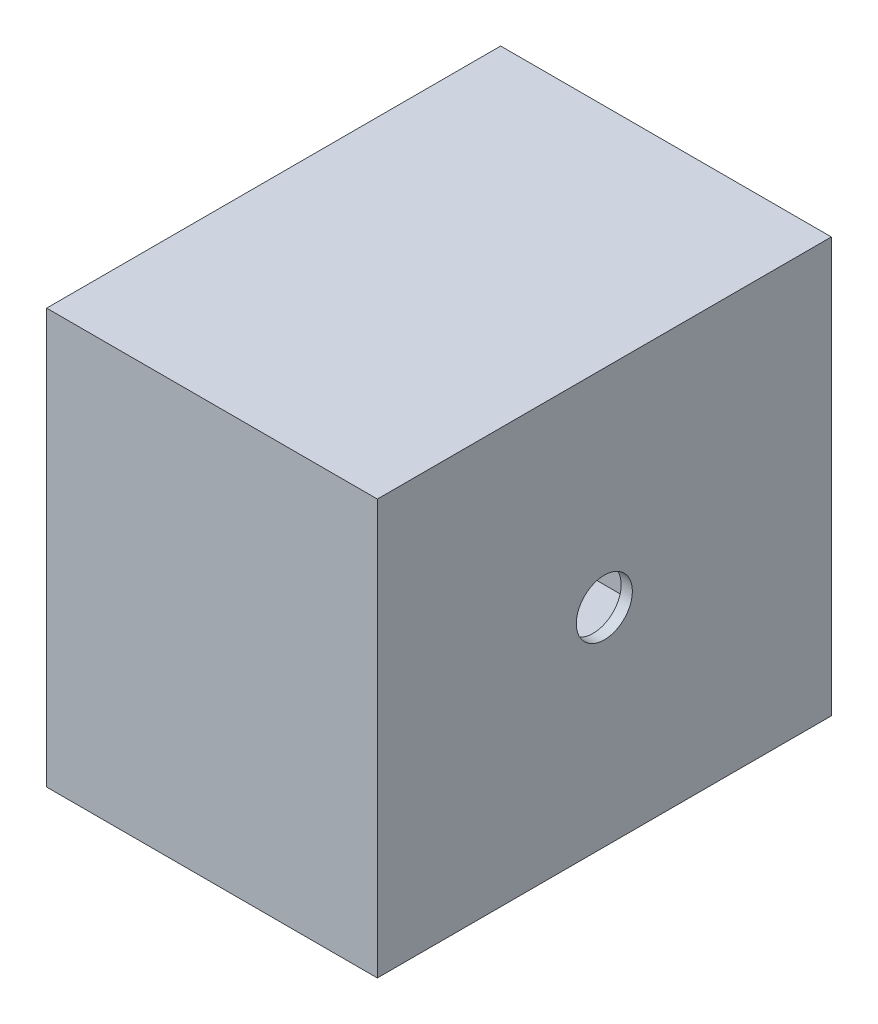
ISO-10303-21;
HEADER;
FILE_DESCRIPTION(('STEP AP214'),'2;1');
FILE_NAME('part.step','',(''),(''),'','','');
FILE_SCHEMA(('AUTOMOTIVE_DESIGN { 1 0 10303 214 1 1 1 1 }'));
ENDSEC;
DATA;
#1=APPLICATION_CONTEXT('core data for automotive mechanical design processes');
#2=APPLICATION_PROTOCOL_DEFINITION('international standard','automotive_design',2000,#1);
#3=PRODUCT_CONTEXT('',#1,'mechanical');
#4=PRODUCT('Part','Part','',(#3));
#5=PRODUCT_RELATED_PRODUCT_CATEGORY('part','',(#4));
#6=PRODUCT_DEFINITION_FORMATION('','',#4);
#7=PRODUCT_DEFINITION_CONTEXT('part definition',#1,'design');
#8=PRODUCT_DEFINITION('design','',#6,#7);
#9=PRODUCT_DEFINITION_SHAPE('','',#8);
#10=(LENGTH_UNIT() NAMED_UNIT(*) SI_UNIT(.MILLI.,.METRE.));
#11=(NAMED_UNIT(*) PLANE_ANGLE_UNIT() SI_UNIT($,.RADIAN.));
#12=(NAMED_UNIT(*) SI_UNIT($,.STERADIAN.) SOLID_ANGLE_UNIT());
#13=UNCERTAINTY_MEASURE_WITH_UNIT(LENGTH_MEASURE(1.E-05),#10,'distance_accuracy_value','');
#14=(GEOMETRIC_REPRESENTATION_CONTEXT(3) GLOBAL_UNCERTAINTY_ASSIGNED_CONTEXT((#13)) GLOBAL_UNIT_ASSIGNED_CONTEXT((#10,
#11,#12)) REPRESENTATION_CONTEXT('',''));
#15=CARTESIAN_POINT('',(0.,0.,0.));
#16=DIRECTION('',(0.,0.,1.));
#17=DIRECTION('',(1.,0.,0.));
#18=AXIS2_PLACEMENT_3D('',#15,#16,#17);
#19=CARTESIAN_POINT('',(160.,0.,0.));
#20=DIRECTION('',(-1.,0.,0.));
#21=DIRECTION('',(0.,0.,1.));
#22=AXIS2_PLACEMENT_3D('',#19,#20,#21);
#23=CYLINDRICAL_SURFACE('',#22,5.);
#24=CARTESIAN_POINT('',(2.,0.,0.));
#25=DIRECTION('',(-1.,0.,0.));
#26=DIRECTION('',(0.,0.,1.));
#27=AXIS2_PLACEMENT_3D('',#24,#25,#26);
#28=CIRCLE('',#27,5.);
#29=CARTESIAN_POINT('',(2.,0.,5.));
#30=VERTEX_POINT('',#29);
#31=EDGE_CURVE('E52',#30,#30,#28,.T.);
#32=ORIENTED_EDGE('',*,*,#31,.F.);
#33=EDGE_LOOP('',(#32));
#34=FACE_BOUND('',#33,.T.);
#35=CARTESIAN_POINT('',(0.,0.,0.));
#36=DIRECTION('',(1.,0.,0.));
#37=DIRECTION('',(0.,0.,-1.));
#38=AXIS2_PLACEMENT_3D('',#35,#36,#37);
#39=CIRCLE('',#38,5.);
#40=CARTESIAN_POINT('',(0.,0.,-5.));
#41=VERTEX_POINT('',#40);
#42=EDGE_CURVE('E182',#41,#41,#39,.T.);
#43=ORIENTED_EDGE('',*,*,#42,.F.);
#44=EDGE_LOOP('',(#43));
#45=FACE_BOUND('',#44,.T.);
#46=ADVANCED_FACE('F48',(#34,#45),#23,.F.);
#47=CARTESIAN_POINT('',(59.,37.,-40.5));
#48=DIRECTION('',(0.,0.,1.));
#49=DIRECTION('',(0.,-1.,0.));
#50=AXIS2_PLACEMENT_3D('',#47,#48,#49);
#51=PLANE('',#50);
#52=DIRECTION('',(0.,1.,0.));
#53=VECTOR('',#52,1.);
#54=CARTESIAN_POINT('',(0.,37.,-40.5));
#55=LINE('',#54,#53);
#56=CARTESIAN_POINT('',(0.,-37.,-40.5));
#57=VERTEX_POINT('',#56);
#58=CARTESIAN_POINT('',(0.,37.,-40.5));
#59=VERTEX_POINT('',#58);
#60=EDGE_CURVE('E190',#57,#59,#55,.T.);
#61=ORIENTED_EDGE('',*,*,#60,.T.);
#62=DIRECTION('',(-1.,0.,0.));
#63=VECTOR('',#62,1.);
#64=CARTESIAN_POINT('',(59.,37.,-40.5));
#65=LINE('',#64,#63);
#66=CARTESIAN_POINT('',(59.,37.,-40.5));
#67=VERTEX_POINT('',#66);
#68=EDGE_CURVE('E11',#67,#59,#65,.T.);
#69=ORIENTED_EDGE('',*,*,#68,.F.);
#70=DIRECTION('',(0.,1.,0.));
#71=VECTOR('',#70,1.);
#72=CARTESIAN_POINT('',(59.,37.,-40.5));
#73=LINE('',#72,#71);
#74=CARTESIAN_POINT('',(59.,-37.,-40.5));
#75=VERTEX_POINT('',#74);
#76=EDGE_CURVE('E191',#75,#67,#73,.T.);
#77=ORIENTED_EDGE('',*,*,#76,.F.);
#78=DIRECTION('',(-1.,0.,0.));
#79=VECTOR('',#78,1.);
#80=CARTESIAN_POINT('',(59.,-37.,-40.5));
#81=LINE('',#80,#79);
#82=EDGE_CURVE('E201',#75,#57,#81,.T.);
#83=ORIENTED_EDGE('',*,*,#82,.T.);
#84=EDGE_LOOP('',(#61,#69,#77,#83));
#85=FACE_BOUND('',#84,.T.);
#86=ADVANCED_FACE('F50',(#85),#51,.F.);
#87=CARTESIAN_POINT('',(59.,37.,40.5));
#88=DIRECTION('',(0.,-1.,0.));
#89=DIRECTION('',(0.,0.,-1.));
#90=AXIS2_PLACEMENT_3D('',#87,#88,#89);
#91=PLANE('',#90);
#92=DIRECTION('',(0.,0.,1.));
#93=VECTOR('',#92,1.);
#94=CARTESIAN_POINT('',(0.,37.,40.5));
#95=LINE('',#94,#93);
#96=CARTESIAN_POINT('',(0.,37.,40.5));
#97=VERTEX_POINT('',#96);
#98=EDGE_CURVE('E205',#59,#97,#95,.T.);
#99=ORIENTED_EDGE('',*,*,#98,.T.);
#100=DIRECTION('',(-1.,0.,0.));
#101=VECTOR('',#100,1.);
#102=CARTESIAN_POINT('',(59.,37.,40.5));
#103=LINE('',#102,#101);
#104=CARTESIAN_POINT('',(59.,37.,40.5));
#105=VERTEX_POINT('',#104);
#106=EDGE_CURVE('E59',#105,#97,#103,.T.);
#107=ORIENTED_EDGE('',*,*,#106,.F.);
#108=DIRECTION('',(0.,0.,1.));
#109=VECTOR('',#108,1.);
#110=CARTESIAN_POINT('',(59.,37.,40.5));
#111=LINE('',#110,#109);
#112=EDGE_CURVE('E99',#67,#105,#111,.T.);
#113=ORIENTED_EDGE('',*,*,#112,.F.);
#114=ORIENTED_EDGE('',*,*,#68,.T.);
#115=EDGE_LOOP('',(#99,#107,#113,#114));
#116=FACE_BOUND('',#115,.T.);
#117=ADVANCED_FACE('F247',(#116),#91,.F.);
#118=CARTESIAN_POINT('',(59.,37.,40.5));
#119=DIRECTION('',(0.,0.,-1.));
#120=DIRECTION('',(0.,1.,0.));
#121=AXIS2_PLACEMENT_3D('',#118,#119,#120);
#122=PLANE('',#121);
#123=DIRECTION('',(0.,-1.,0.));
#124=VECTOR('',#123,1.);
#125=CARTESIAN_POINT('',(0.,37.,40.5));
#126=LINE('',#125,#124);
#127=CARTESIAN_POINT('',(0.,-37.,40.5));
#128=VERTEX_POINT('',#127);
#129=EDGE_CURVE('E86',#97,#128,#126,.T.);
#130=ORIENTED_EDGE('',*,*,#129,.T.);
#131=DIRECTION('',(-1.,0.,0.));
#132=VECTOR('',#131,1.);
#133=CARTESIAN_POINT('',(59.,-37.,40.5));
#134=LINE('',#133,#132);
#135=CARTESIAN_POINT('',(59.,-37.,40.5));
#136=VERTEX_POINT('',#135);
#137=EDGE_CURVE('E214',#136,#128,#134,.T.);
#138=ORIENTED_EDGE('',*,*,#137,.F.);
#139=DIRECTION('',(0.,-1.,0.));
#140=VECTOR('',#139,1.);
#141=CARTESIAN_POINT('',(59.,37.,40.5));
#142=LINE('',#141,#140);
#143=EDGE_CURVE('E196',#105,#136,#142,.T.);
#144=ORIENTED_EDGE('',*,*,#143,.F.);
#145=ORIENTED_EDGE('',*,*,#106,.T.);
#146=EDGE_LOOP('',(#130,#138,#144,#145));
#147=FACE_BOUND('',#146,.T.);
#148=ADVANCED_FACE('F246',(#147),#122,.F.);
#149=CARTESIAN_POINT('',(59.,-37.,40.5));
#150=DIRECTION('',(0.,1.,0.));
#151=DIRECTION('',(0.,0.,1.));
#152=AXIS2_PLACEMENT_3D('',#149,#150,#151);
#153=PLANE('',#152);
#154=DIRECTION('',(0.,0.,-1.));
#155=VECTOR('',#154,1.);
#156=CARTESIAN_POINT('',(0.,-37.,40.5));
#157=LINE('',#156,#155);
#158=EDGE_CURVE('E92',#128,#57,#157,.T.);
#159=ORIENTED_EDGE('',*,*,#158,.T.);
#160=ORIENTED_EDGE('',*,*,#82,.F.);
#161=DIRECTION('',(0.,0.,-1.));
#162=VECTOR('',#161,1.);
#163=CARTESIAN_POINT('',(59.,-37.,40.5));
#164=LINE('',#163,#162);
#165=EDGE_CURVE('E68',#136,#75,#164,.T.);
#166=ORIENTED_EDGE('',*,*,#165,.F.);
#167=ORIENTED_EDGE('',*,*,#137,.T.);
#168=EDGE_LOOP('',(#159,#160,#166,#167));
#169=FACE_BOUND('',#168,.T.);
#170=ADVANCED_FACE('F244',(#169),#153,.F.);
#171=CARTESIAN_POINT('',(59.,0.,0.));
#172=DIRECTION('',(1.,0.,0.));
#173=DIRECTION('',(0.,0.,-1.));
#174=AXIS2_PLACEMENT_3D('',#171,#172,#173);
#175=PLANE('',#174);
#176=CARTESIAN_POINT('',(59.,0.,0.));
#177=DIRECTION('',(1.,0.,0.));
#178=DIRECTION('',(0.,0.,-1.));
#179=AXIS2_PLACEMENT_3D('',#176,#177,#178);
#180=CIRCLE('',#179,5.);
#181=CARTESIAN_POINT('',(59.,0.,-5.));
#182=VERTEX_POINT('',#181);
#183=EDGE_CURVE('E186',#182,#182,#180,.F.);
#184=ORIENTED_EDGE('',*,*,#183,.T.);
#185=EDGE_LOOP('',(#184));
#186=FACE_BOUND('',#185,.T.);
#187=ORIENTED_EDGE('',*,*,#76,.T.);
#188=ORIENTED_EDGE('',*,*,#112,.T.);
#189=ORIENTED_EDGE('',*,*,#143,.T.);
#190=ORIENTED_EDGE('',*,*,#165,.T.);
#191=EDGE_LOOP('',(#187,#188,#189,#190));
#192=FACE_BOUND('',#191,.T.);
#193=ADVANCED_FACE('F238',(#186,#192),#175,.T.);
#194=CARTESIAN_POINT('',(0.,0.,0.));
#195=DIRECTION('',(1.,0.,0.));
#196=DIRECTION('',(0.,0.,-1.));
#197=AXIS2_PLACEMENT_3D('',#194,#195,#196);
#198=PLANE('',#197);
#199=ORIENTED_EDGE('',*,*,#42,.T.);
#200=EDGE_LOOP('',(#199));
#201=FACE_BOUND('',#200,.T.);
#202=ORIENTED_EDGE('',*,*,#60,.F.);
#203=ORIENTED_EDGE('',*,*,#158,.F.);
#204=ORIENTED_EDGE('',*,*,#129,.F.);
#205=ORIENTED_EDGE('',*,*,#98,.F.);
#206=EDGE_LOOP('',(#202,#203,#204,#205));
#207=FACE_BOUND('',#206,.T.);
#208=ADVANCED_FACE('F235',(#201,#207),#198,.F.);
#209=CARTESIAN_POINT('',(57.,0.,0.));
#210=DIRECTION('',(1.,0.,0.));
#211=DIRECTION('',(0.,0.,-1.));
#212=AXIS2_PLACEMENT_3D('',#209,#210,#211);
#213=CIRCLE('',#212,5.);
#214=CARTESIAN_POINT('',(57.,0.,-5.));
#215=VERTEX_POINT('',#214);
#216=EDGE_CURVE('E176',#215,#215,#213,.T.);
#217=ORIENTED_EDGE('',*,*,#216,.F.);
#218=EDGE_LOOP('',(#217));
#219=FACE_BOUND('',#218,.T.);
#220=ORIENTED_EDGE('',*,*,#183,.F.);
#221=EDGE_LOOP('',(#220));
#222=FACE_BOUND('',#221,.T.);
#223=ADVANCED_FACE('F232',(#219,#222),#23,.F.);
#224=CARTESIAN_POINT('',(1.99999999999999,-35.,-38.5));
#225=DIRECTION('',(-1.,0.,0.));
#226=DIRECTION('',(0.,0.,1.));
#227=AXIS2_PLACEMENT_3D('',#224,#225,#226);
#228=PLANE('',#227);
#229=ORIENTED_EDGE('',*,*,#31,.T.);
#230=EDGE_LOOP('',(#229));
#231=FACE_BOUND('',#230,.T.);
#232=DIRECTION('',(0.,0.,1.));
#233=VECTOR('',#232,1.);
#234=CARTESIAN_POINT('',(1.99999999999999,35.,-38.5));
#235=LINE('',#234,#233);
#236=CARTESIAN_POINT('',(1.99999999999999,35.,-38.5));
#237=VERTEX_POINT('',#236);
#238=CARTESIAN_POINT('',(2.,35.,38.5));
#239=VERTEX_POINT('',#238);
#240=EDGE_CURVE('E133',#237,#239,#235,.T.);
#241=ORIENTED_EDGE('',*,*,#240,.T.);
#242=DIRECTION('',(0.,1.,0.));
#243=VECTOR('',#242,1.);
#244=CARTESIAN_POINT('',(2.,-35.,38.5));
#245=LINE('',#244,#243);
#246=CARTESIAN_POINT('',(2.,-35.,38.5));
#247=VERTEX_POINT('',#246);
#248=EDGE_CURVE('E126',#247,#239,#245,.T.);
#249=ORIENTED_EDGE('',*,*,#248,.F.);
#250=DIRECTION('',(0.,0.,1.));
#251=VECTOR('',#250,1.);
#252=CARTESIAN_POINT('',(1.99999999999999,-35.,-38.5));
#253=LINE('',#252,#251);
#254=CARTESIAN_POINT('',(1.99999999999999,-35.,-38.5));
#255=VERTEX_POINT('',#254);
#256=EDGE_CURVE('E130',#255,#247,#253,.T.);
#257=ORIENTED_EDGE('',*,*,#256,.F.);
#258=DIRECTION('',(0.,1.,0.));
#259=VECTOR('',#258,1.);
#260=CARTESIAN_POINT('',(1.99999999999999,-35.,-38.5));
#261=LINE('',#260,#259);
#262=EDGE_CURVE('E173',#255,#237,#261,.T.);
#263=ORIENTED_EDGE('',*,*,#262,.T.);
#264=EDGE_LOOP('',(#241,#249,#257,#263));
#265=FACE_BOUND('',#264,.T.);
#266=ADVANCED_FACE('F128',(#231,#265),#228,.F.);
#267=CARTESIAN_POINT('',(1.99999999999999,-35.,-38.5));
#268=DIRECTION('',(0.,0.,-1.));
#269=DIRECTION('',(-1.,0.,0.));
#270=AXIS2_PLACEMENT_3D('',#267,#268,#269);
#271=PLANE('',#270);
#272=DIRECTION('',(-1.,0.,0.));
#273=VECTOR('',#272,1.);
#274=CARTESIAN_POINT('',(1.99999999999999,35.,-38.5));
#275=LINE('',#274,#273);
#276=CARTESIAN_POINT('',(57.,35.,-38.5));
#277=VERTEX_POINT('',#276);
#278=EDGE_CURVE('E153',#277,#237,#275,.T.);
#279=ORIENTED_EDGE('',*,*,#278,.T.);
#280=ORIENTED_EDGE('',*,*,#262,.F.);
#281=DIRECTION('',(-1.,0.,0.));
#282=VECTOR('',#281,1.);
#283=CARTESIAN_POINT('',(1.99999999999999,-35.,-38.5));
#284=LINE('',#283,#282);
#285=CARTESIAN_POINT('',(57.,-35.,-38.5));
#286=VERTEX_POINT('',#285);
#287=EDGE_CURVE('E139',#286,#255,#284,.T.);
#288=ORIENTED_EDGE('',*,*,#287,.F.);
#289=DIRECTION('',(0.,1.,0.));
#290=VECTOR('',#289,1.);
#291=CARTESIAN_POINT('',(57.,-35.,-38.5));
#292=LINE('',#291,#290);
#293=EDGE_CURVE('E177',#286,#277,#292,.T.);
#294=ORIENTED_EDGE('',*,*,#293,.T.);
#295=EDGE_LOOP('',(#279,#280,#288,#294));
#296=FACE_BOUND('',#295,.T.);
#297=ADVANCED_FACE('F263',(#296),#271,.F.);
#298=CARTESIAN_POINT('',(57.,-35.,-38.5));
#299=DIRECTION('',(1.,0.,0.));
#300=DIRECTION('',(0.,0.,-1.));
#301=AXIS2_PLACEMENT_3D('',#298,#299,#300);
#302=PLANE('',#301);
#303=ORIENTED_EDGE('',*,*,#216,.T.);
#304=EDGE_LOOP('',(#303));
#305=FACE_BOUND('',#304,.T.);
#306=DIRECTION('',(0.,0.,-1.));
#307=VECTOR('',#306,1.);
#308=CARTESIAN_POINT('',(57.,35.,-38.5));
#309=LINE('',#308,#307);
#310=CARTESIAN_POINT('',(57.,35.,38.5));
#311=VERTEX_POINT('',#310);
#312=EDGE_CURVE('E160',#311,#277,#309,.T.);
#313=ORIENTED_EDGE('',*,*,#312,.T.);
#314=ORIENTED_EDGE('',*,*,#293,.F.);
#315=DIRECTION('',(0.,0.,-1.));
#316=VECTOR('',#315,1.);
#317=CARTESIAN_POINT('',(57.,-35.,-38.5));
#318=LINE('',#317,#316);
#319=CARTESIAN_POINT('',(57.,-35.,38.5));
#320=VERTEX_POINT('',#319);
#321=EDGE_CURVE('E148',#320,#286,#318,.T.);
#322=ORIENTED_EDGE('',*,*,#321,.F.);
#323=DIRECTION('',(0.,1.,0.));
#324=VECTOR('',#323,1.);
#325=CARTESIAN_POINT('',(57.,-35.,38.5));
#326=LINE('',#325,#324);
#327=EDGE_CURVE('E138',#320,#311,#326,.T.);
#328=ORIENTED_EDGE('',*,*,#327,.T.);
#329=EDGE_LOOP('',(#313,#314,#322,#328));
#330=FACE_BOUND('',#329,.T.);
#331=ADVANCED_FACE('F266',(#305,#330),#302,.F.);
#332=CARTESIAN_POINT('',(2.,-35.,38.5));
#333=DIRECTION('',(0.,0.,1.));
#334=DIRECTION('',(1.,0.,0.));
#335=AXIS2_PLACEMENT_3D('',#332,#333,#334);
#336=PLANE('',#335);
#337=DIRECTION('',(1.,0.,0.));
#338=VECTOR('',#337,1.);
#339=CARTESIAN_POINT('',(2.,35.,38.5));
#340=LINE('',#339,#338);
#341=EDGE_CURVE('E168',#239,#311,#340,.T.);
#342=ORIENTED_EDGE('',*,*,#341,.T.);
#343=ORIENTED_EDGE('',*,*,#327,.F.);
#344=DIRECTION('',(1.,0.,0.));
#345=VECTOR('',#344,1.);
#346=CARTESIAN_POINT('',(2.,-35.,38.5));
#347=LINE('',#346,#345);
#348=EDGE_CURVE('E142',#247,#320,#347,.T.);
#349=ORIENTED_EDGE('',*,*,#348,.F.);
#350=ORIENTED_EDGE('',*,*,#248,.T.);
#351=EDGE_LOOP('',(#342,#343,#349,#350));
#352=FACE_BOUND('',#351,.T.);
#353=ADVANCED_FACE('F143',(#352),#336,.F.);
#354=CARTESIAN_POINT('',(0.,-35.,0.));
#355=DIRECTION('',(0.,1.,0.));
#356=DIRECTION('',(0.,0.,1.));
#357=AXIS2_PLACEMENT_3D('',#354,#355,#356);
#358=PLANE('',#357);
#359=ORIENTED_EDGE('',*,*,#256,.T.);
#360=ORIENTED_EDGE('',*,*,#348,.T.);
#361=ORIENTED_EDGE('',*,*,#321,.T.);
#362=ORIENTED_EDGE('',*,*,#287,.T.);
#363=EDGE_LOOP('',(#359,#360,#361,#362));
#364=FACE_BOUND('',#363,.T.);
#365=ADVANCED_FACE('F150',(#364),#358,.T.);
#366=CARTESIAN_POINT('',(0.,35.,0.));
#367=DIRECTION('',(0.,1.,0.));
#368=DIRECTION('',(0.,0.,1.));
#369=AXIS2_PLACEMENT_3D('',#366,#367,#368);
#370=PLANE('',#369);
#371=ORIENTED_EDGE('',*,*,#240,.F.);
#372=ORIENTED_EDGE('',*,*,#278,.F.);
#373=ORIENTED_EDGE('',*,*,#312,.F.);
#374=ORIENTED_EDGE('',*,*,#341,.F.);
#375=EDGE_LOOP('',(#371,#372,#373,#374));
#376=FACE_BOUND('',#375,.T.);
#377=ADVANCED_FACE('F272',(#376),#370,.F.);
#378=CLOSED_SHELL('',(#46,#86,#117,#148,#170,#193,#208,#223,#266,#297,#331,#353,#365,#377));
#379=MANIFOLD_SOLID_BREP('B2',#378);
#380=ADVANCED_BREP_SHAPE_REPRESENTATION('',(#18,#379),#14);
#381=SHAPE_DEFINITION_REPRESENTATION(#9,#380);
ENDSEC;
END-ISO-10303-21;
